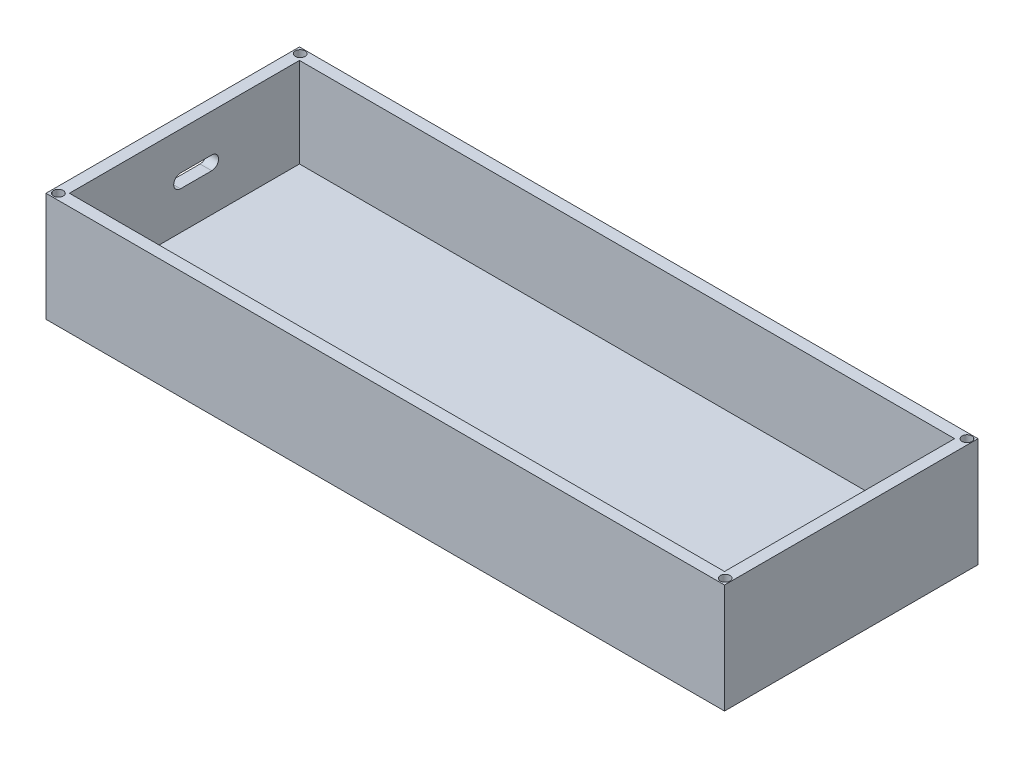
ISO-10303-21;
HEADER;
FILE_DESCRIPTION(('STEP AP214'),'2;1');
FILE_NAME('part.step','',(''),(''),'','','');
FILE_SCHEMA(('AUTOMOTIVE_DESIGN { 1 0 10303 214 1 1 1 1 }'));
ENDSEC;
DATA;
#1=APPLICATION_CONTEXT('core data for automotive mechanical design processes');
#2=APPLICATION_PROTOCOL_DEFINITION('international standard','automotive_design',2000,#1);
#3=PRODUCT_CONTEXT('',#1,'mechanical');
#4=PRODUCT('Part','Part','',(#3));
#5=PRODUCT_RELATED_PRODUCT_CATEGORY('part','',(#4));
#6=PRODUCT_DEFINITION_FORMATION('','',#4);
#7=PRODUCT_DEFINITION_CONTEXT('part definition',#1,'design');
#8=PRODUCT_DEFINITION('design','',#6,#7);
#9=PRODUCT_DEFINITION_SHAPE('','',#8);
#10=(LENGTH_UNIT() NAMED_UNIT(*) SI_UNIT(.MILLI.,.METRE.));
#11=(NAMED_UNIT(*) PLANE_ANGLE_UNIT() SI_UNIT($,.RADIAN.));
#12=(NAMED_UNIT(*) SI_UNIT($,.STERADIAN.) SOLID_ANGLE_UNIT());
#13=UNCERTAINTY_MEASURE_WITH_UNIT(LENGTH_MEASURE(1.E-05),#10,'distance_accuracy_value','');
#14=(GEOMETRIC_REPRESENTATION_CONTEXT(3) GLOBAL_UNCERTAINTY_ASSIGNED_CONTEXT((#13)) GLOBAL_UNIT_ASSIGNED_CONTEXT((#10,
#11,#12)) REPRESENTATION_CONTEXT('',''));
#15=CARTESIAN_POINT('',(0.,0.,0.));
#16=DIRECTION('',(0.,0.,1.));
#17=DIRECTION('',(1.,0.,0.));
#18=AXIS2_PLACEMENT_3D('',#15,#16,#17);
#19=CARTESIAN_POINT('',(129.071142086162,24.,-29.5899705380453));
#20=DIRECTION('',(0.,1.,0.));
#21=DIRECTION('',(0.,0.,1.));
#22=AXIS2_PLACEMENT_3D('',#19,#20,#21);
#23=PLANE('',#22);
#24=CARTESIAN_POINT('',(129.071142086162,24.,-29.5899705380453));
#25=DIRECTION('',(0.,1.,0.));
#26=DIRECTION('',(0.,0.,1.));
#27=AXIS2_PLACEMENT_3D('',#24,#25,#26);
#28=CIRCLE('',#27,1.25);
#29=CARTESIAN_POINT('',(129.071142086162,24.,-28.3399705380453));
#30=VERTEX_POINT('',#29);
#31=EDGE_CURVE('E11',#30,#30,#28,.T.);
#32=ORIENTED_EDGE('',*,*,#31,.T.);
#33=EDGE_LOOP('',(#32));
#34=FACE_BOUND('',#33,.T.);
#35=ADVANCED_FACE('F33',(#34),#23,.T.);
#36=CARTESIAN_POINT('',(129.071142086162,24.,-29.5899705380453));
#37=DIRECTION('',(0.,1.,0.));
#38=DIRECTION('',(0.,0.,1.));
#39=AXIS2_PLACEMENT_3D('',#36,#37,#38);
#40=CYLINDRICAL_SURFACE('',#39,1.25);
#41=ORIENTED_EDGE('',*,*,#31,.F.);
#42=EDGE_LOOP('',(#41));
#43=FACE_BOUND('',#42,.T.);
#44=CARTESIAN_POINT('',(129.071142086162,28.,-29.5899705380453));
#45=DIRECTION('',(0.,1.,0.));
#46=DIRECTION('',(0.,0.,1.));
#47=AXIS2_PLACEMENT_3D('',#44,#45,#46);
#48=CIRCLE('',#47,1.25);
#49=CARTESIAN_POINT('',(129.071142086162,28.,-28.3399705380453));
#50=VERTEX_POINT('',#49);
#51=EDGE_CURVE('E40',#50,#50,#48,.T.);
#52=ORIENTED_EDGE('',*,*,#51,.T.);
#53=EDGE_LOOP('',(#52));
#54=FACE_BOUND('',#53,.T.);
#55=ADVANCED_FACE('F226',(#43,#54),#40,.F.);
#56=CARTESIAN_POINT('',(129.071142086162,24.,32.4100294619547));
#57=DIRECTION('',(0.,1.,0.));
#58=DIRECTION('',(0.,0.,1.));
#59=AXIS2_PLACEMENT_3D('',#56,#57,#58);
#60=PLANE('',#59);
#61=CARTESIAN_POINT('',(129.071142086162,24.,32.4100294619547));
#62=DIRECTION('',(0.,1.,0.));
#63=DIRECTION('',(0.,0.,1.));
#64=AXIS2_PLACEMENT_3D('',#61,#62,#63);
#65=CIRCLE('',#64,1.25);
#66=CARTESIAN_POINT('',(129.071142086162,24.,33.6600294619547));
#67=VERTEX_POINT('',#66);
#68=EDGE_CURVE('E221',#67,#67,#65,.T.);
#69=ORIENTED_EDGE('',*,*,#68,.T.);
#70=EDGE_LOOP('',(#69));
#71=FACE_BOUND('',#70,.T.);
#72=ADVANCED_FACE('F252',(#71),#60,.T.);
#73=CARTESIAN_POINT('',(129.071142086162,24.,32.4100294619547));
#74=DIRECTION('',(0.,1.,0.));
#75=DIRECTION('',(0.,0.,1.));
#76=AXIS2_PLACEMENT_3D('',#73,#74,#75);
#77=CYLINDRICAL_SURFACE('',#76,1.25);
#78=ORIENTED_EDGE('',*,*,#68,.F.);
#79=EDGE_LOOP('',(#78));
#80=FACE_BOUND('',#79,.T.);
#81=CARTESIAN_POINT('',(129.071142086162,28.,32.4100294619547));
#82=DIRECTION('',(0.,1.,0.));
#83=DIRECTION('',(0.,0.,1.));
#84=AXIS2_PLACEMENT_3D('',#81,#82,#83);
#85=CIRCLE('',#84,1.25);
#86=CARTESIAN_POINT('',(129.071142086162,28.,33.6600294619547));
#87=VERTEX_POINT('',#86);
#88=EDGE_CURVE('E218',#87,#87,#85,.T.);
#89=ORIENTED_EDGE('',*,*,#88,.T.);
#90=EDGE_LOOP('',(#89));
#91=FACE_BOUND('',#90,.T.);
#92=ADVANCED_FACE('F258',(#80,#91),#77,.F.);
#93=CARTESIAN_POINT('',(-43.5146443514644,5.,-31.0041841004184));
#94=DIRECTION('',(1.,0.,0.));
#95=DIRECTION('',(0.,0.,-1.));
#96=AXIS2_PLACEMENT_3D('',#93,#94,#95);
#97=PLANE('',#96);
#98=DIRECTION('',(0.,0.,1.));
#99=VECTOR('',#98,1.);
#100=CARTESIAN_POINT('',(-43.5146443514644,14.75,-5.5041841004184));
#101=LINE('',#100,#99);
#102=CARTESIAN_POINT('',(-43.5146443514644,14.75,-5.5041841004184));
#103=VERTEX_POINT('',#102);
#104=CARTESIAN_POINT('',(-43.5146443514644,14.75,2.49581589958159));
#105=VERTEX_POINT('',#104);
#106=EDGE_CURVE('E133',#103,#105,#101,.T.);
#107=ORIENTED_EDGE('',*,*,#106,.F.);
#108=CARTESIAN_POINT('',(-43.5146443514644,16.5,-5.5041841004184));
#109=DIRECTION('',(-1.,0.,0.));
#110=DIRECTION('',(0.,0.,1.));
#111=AXIS2_PLACEMENT_3D('',#108,#109,#110);
#112=CIRCLE('',#111,1.75);
#113=CARTESIAN_POINT('',(-43.5146443514644,18.25,-5.5041841004184));
#114=VERTEX_POINT('',#113);
#115=EDGE_CURVE('E47',#114,#103,#112,.T.);
#116=ORIENTED_EDGE('',*,*,#115,.F.);
#117=DIRECTION('',(0.,0.,-1.));
#118=VECTOR('',#117,1.);
#119=CARTESIAN_POINT('',(-43.5146443514644,18.25,-5.5041841004184));
#120=LINE('',#119,#118);
#121=CARTESIAN_POINT('',(-43.5146443514644,18.25,2.4958158995816));
#122=VERTEX_POINT('',#121);
#123=EDGE_CURVE('E140',#122,#114,#120,.T.);
#124=ORIENTED_EDGE('',*,*,#123,.F.);
#125=CARTESIAN_POINT('',(-43.5146443514644,16.5,2.4958158995816));
#126=DIRECTION('',(-1.,0.,0.));
#127=DIRECTION('',(0.,0.,1.));
#128=AXIS2_PLACEMENT_3D('',#125,#126,#127);
#129=CIRCLE('',#128,1.75);
#130=EDGE_CURVE('E124',#105,#122,#129,.T.);
#131=ORIENTED_EDGE('',*,*,#130,.F.);
#132=EDGE_LOOP('',(#107,#116,#124,#131));
#133=FACE_BOUND('',#132,.T.);
#134=DIRECTION('',(0.,0.,1.));
#135=VECTOR('',#134,1.);
#136=CARTESIAN_POINT('',(-43.5146443514644,0.,-31.0041841004184));
#137=LINE('',#136,#135);
#138=CARTESIAN_POINT('',(-43.5146443514644,0.,-31.0041841004184));
#139=VERTEX_POINT('',#138);
#140=CARTESIAN_POINT('',(-43.5146443514644,0.,33.9958158995816));
#141=VERTEX_POINT('',#140);
#142=EDGE_CURVE('E190',#139,#141,#137,.T.);
#143=ORIENTED_EDGE('',*,*,#142,.T.);
#144=DIRECTION('',(0.,-1.,0.));
#145=VECTOR('',#144,1.);
#146=CARTESIAN_POINT('',(-43.5146443514644,5.,33.9958158995816));
#147=LINE('',#146,#145);
#148=CARTESIAN_POINT('',(-43.5146443514644,28.,33.9958158995816));
#149=VERTEX_POINT('',#148);
#150=EDGE_CURVE('E208',#149,#141,#147,.T.);
#151=ORIENTED_EDGE('',*,*,#150,.F.);
#152=DIRECTION('',(0.,0.,1.));
#153=VECTOR('',#152,1.);
#154=CARTESIAN_POINT('',(-43.5146443514644,28.,33.9958158995816));
#155=LINE('',#154,#153);
#156=CARTESIAN_POINT('',(-43.5146443514644,28.,-31.0041841004184));
#157=VERTEX_POINT('',#156);
#158=EDGE_CURVE('E178',#157,#149,#155,.T.);
#159=ORIENTED_EDGE('',*,*,#158,.F.);
#160=DIRECTION('',(0.,-1.,0.));
#161=VECTOR('',#160,1.);
#162=CARTESIAN_POINT('',(-43.5146443514644,5.,-31.0041841004184));
#163=LINE('',#162,#161);
#164=EDGE_CURVE('E199',#157,#139,#163,.T.);
#165=ORIENTED_EDGE('',*,*,#164,.T.);
#166=EDGE_LOOP('',(#143,#151,#159,#165));
#167=FACE_BOUND('',#166,.T.);
#168=ADVANCED_FACE('F137',(#133,#167),#97,.F.);
#169=CARTESIAN_POINT('',(-43.5146443514644,5.,33.9958158995816));
#170=DIRECTION('',(0.,0.,-1.));
#171=DIRECTION('',(-1.,0.,0.));
#172=AXIS2_PLACEMENT_3D('',#169,#170,#171);
#173=PLANE('',#172);
#174=DIRECTION('',(1.,0.,0.));
#175=VECTOR('',#174,1.);
#176=CARTESIAN_POINT('',(-43.5146443514644,0.,33.9958158995816));
#177=LINE('',#176,#175);
#178=CARTESIAN_POINT('',(130.485355648536,0.,33.9958158995816));
#179=VERTEX_POINT('',#178);
#180=EDGE_CURVE('E193',#141,#179,#177,.T.);
#181=ORIENTED_EDGE('',*,*,#180,.T.);
#182=DIRECTION('',(0.,-1.,0.));
#183=VECTOR('',#182,1.);
#184=CARTESIAN_POINT('',(130.485355648536,5.,33.9958158995816));
#185=LINE('',#184,#183);
#186=CARTESIAN_POINT('',(130.485355648536,28.,33.9958158995816));
#187=VERTEX_POINT('',#186);
#188=EDGE_CURVE('E205',#187,#179,#185,.T.);
#189=ORIENTED_EDGE('',*,*,#188,.F.);
#190=DIRECTION('',(1.,0.,0.));
#191=VECTOR('',#190,1.);
#192=CARTESIAN_POINT('',(-43.5146443514644,28.,33.9958158995816));
#193=LINE('',#192,#191);
#194=EDGE_CURVE('E181',#149,#187,#193,.T.);
#195=ORIENTED_EDGE('',*,*,#194,.F.);
#196=ORIENTED_EDGE('',*,*,#150,.T.);
#197=EDGE_LOOP('',(#181,#189,#195,#196));
#198=FACE_BOUND('',#197,.T.);
#199=ADVANCED_FACE('F267',(#198),#173,.F.);
#200=CARTESIAN_POINT('',(130.485355648536,5.,-31.0041841004184));
#201=DIRECTION('',(-1.,0.,0.));
#202=DIRECTION('',(0.,0.,1.));
#203=AXIS2_PLACEMENT_3D('',#200,#201,#202);
#204=PLANE('',#203);
#205=DIRECTION('',(0.,0.,-1.));
#206=VECTOR('',#205,1.);
#207=CARTESIAN_POINT('',(130.485355648536,0.,-31.0041841004184));
#208=LINE('',#207,#206);
#209=CARTESIAN_POINT('',(130.485355648536,0.,-31.0041841004184));
#210=VERTEX_POINT('',#209);
#211=EDGE_CURVE('E195',#179,#210,#208,.T.);
#212=ORIENTED_EDGE('',*,*,#211,.T.);
#213=DIRECTION('',(0.,-1.,0.));
#214=VECTOR('',#213,1.);
#215=CARTESIAN_POINT('',(130.485355648536,5.,-31.0041841004184));
#216=LINE('',#215,#214);
#217=CARTESIAN_POINT('',(130.485355648536,28.,-31.0041841004184));
#218=VERTEX_POINT('',#217);
#219=EDGE_CURVE('E202',#218,#210,#216,.T.);
#220=ORIENTED_EDGE('',*,*,#219,.F.);
#221=DIRECTION('',(0.,0.,-1.));
#222=VECTOR('',#221,1.);
#223=CARTESIAN_POINT('',(130.485355648536,28.,33.9958158995816));
#224=LINE('',#223,#222);
#225=EDGE_CURVE('E184',#187,#218,#224,.T.);
#226=ORIENTED_EDGE('',*,*,#225,.F.);
#227=ORIENTED_EDGE('',*,*,#188,.T.);
#228=EDGE_LOOP('',(#212,#220,#226,#227));
#229=FACE_BOUND('',#228,.T.);
#230=ADVANCED_FACE('F270',(#229),#204,.F.);
#231=CARTESIAN_POINT('',(-43.5146443514644,5.,-31.0041841004184));
#232=DIRECTION('',(0.,0.,1.));
#233=DIRECTION('',(1.,0.,0.));
#234=AXIS2_PLACEMENT_3D('',#231,#232,#233);
#235=PLANE('',#234);
#236=DIRECTION('',(-1.,0.,0.));
#237=VECTOR('',#236,1.);
#238=CARTESIAN_POINT('',(-43.5146443514644,0.,-31.0041841004184));
#239=LINE('',#238,#237);
#240=EDGE_CURVE('E197',#210,#139,#239,.T.);
#241=ORIENTED_EDGE('',*,*,#240,.T.);
#242=ORIENTED_EDGE('',*,*,#164,.F.);
#243=DIRECTION('',(-1.,0.,0.));
#244=VECTOR('',#243,1.);
#245=CARTESIAN_POINT('',(-43.5146443514644,28.,-31.0041841004184));
#246=LINE('',#245,#244);
#247=EDGE_CURVE('E187',#218,#157,#246,.T.);
#248=ORIENTED_EDGE('',*,*,#247,.F.);
#249=ORIENTED_EDGE('',*,*,#219,.T.);
#250=EDGE_LOOP('',(#241,#242,#248,#249));
#251=FACE_BOUND('',#250,.T.);
#252=ADVANCED_FACE('F241',(#251),#235,.F.);
#253=CARTESIAN_POINT('',(0.,0.,0.));
#254=DIRECTION('',(0.,1.,0.));
#255=DIRECTION('',(0.,0.,1.));
#256=AXIS2_PLACEMENT_3D('',#253,#254,#255);
#257=PLANE('',#256);
#258=ORIENTED_EDGE('',*,*,#142,.F.);
#259=ORIENTED_EDGE('',*,*,#240,.F.);
#260=ORIENTED_EDGE('',*,*,#211,.F.);
#261=ORIENTED_EDGE('',*,*,#180,.F.);
#262=EDGE_LOOP('',(#258,#259,#260,#261));
#263=FACE_BOUND('',#262,.T.);
#264=ADVANCED_FACE('F231',(#263),#257,.F.);
#265=CARTESIAN_POINT('',(0.,28.,0.));
#266=DIRECTION('',(0.,-1.,0.));
#267=DIRECTION('',(0.,0.,-1.));
#268=AXIS2_PLACEMENT_3D('',#265,#266,#267);
#269=PLANE('',#268);
#270=CARTESIAN_POINT('',(-41.9288579138375,28.,-29.5899705380453));
#271=DIRECTION('',(0.,1.,0.));
#272=DIRECTION('',(0.,0.,1.));
#273=AXIS2_PLACEMENT_3D('',#270,#271,#272);
#274=CIRCLE('',#273,1.25);
#275=CARTESIAN_POINT('',(-41.9288579138375,28.,-28.3399705380453));
#276=VERTEX_POINT('',#275);
#277=EDGE_CURVE('E342',#276,#276,#274,.T.);
#278=ORIENTED_EDGE('',*,*,#277,.F.);
#279=EDGE_LOOP('',(#278));
#280=FACE_BOUND('',#279,.T.);
#281=CARTESIAN_POINT('',(-41.9288579138375,28.,32.4100294619547));
#282=DIRECTION('',(0.,1.,0.));
#283=DIRECTION('',(0.,0.,1.));
#284=AXIS2_PLACEMENT_3D('',#281,#282,#283);
#285=CIRCLE('',#284,1.25);
#286=CARTESIAN_POINT('',(-41.9288579138375,28.,33.6600294619547));
#287=VERTEX_POINT('',#286);
#288=EDGE_CURVE('E341',#287,#287,#285,.T.);
#289=ORIENTED_EDGE('',*,*,#288,.F.);
#290=EDGE_LOOP('',(#289));
#291=FACE_BOUND('',#290,.T.);
#292=ORIENTED_EDGE('',*,*,#158,.T.);
#293=ORIENTED_EDGE('',*,*,#194,.T.);
#294=ORIENTED_EDGE('',*,*,#225,.T.);
#295=ORIENTED_EDGE('',*,*,#247,.T.);
#296=EDGE_LOOP('',(#292,#293,#294,#295));
#297=FACE_BOUND('',#296,.T.);
#298=DIRECTION('',(1.,0.,0.));
#299=VECTOR('',#298,1.);
#300=CARTESIAN_POINT('',(-40.5146443514644,28.,30.9958158995816));
#301=LINE('',#300,#299);
#302=CARTESIAN_POINT('',(-40.5146443514644,28.,30.9958158995816));
#303=VERTEX_POINT('',#302);
#304=CARTESIAN_POINT('',(127.485355648536,28.,30.9958158995816));
#305=VERTEX_POINT('',#304);
#306=EDGE_CURVE('E150',#303,#305,#301,.T.);
#307=ORIENTED_EDGE('',*,*,#306,.F.);
#308=DIRECTION('',(0.,0.,1.));
#309=VECTOR('',#308,1.);
#310=CARTESIAN_POINT('',(-40.5146443514644,28.,30.9958158995816));
#311=LINE('',#310,#309);
#312=CARTESIAN_POINT('',(-40.5146443514644,28.,-28.0041841004184));
#313=VERTEX_POINT('',#312);
#314=EDGE_CURVE('E158',#313,#303,#311,.T.);
#315=ORIENTED_EDGE('',*,*,#314,.F.);
#316=DIRECTION('',(-1.,0.,0.));
#317=VECTOR('',#316,1.);
#318=CARTESIAN_POINT('',(-40.5146443514644,28.,-28.0041841004184));
#319=LINE('',#318,#317);
#320=CARTESIAN_POINT('',(127.485355648536,28.,-28.0041841004184));
#321=VERTEX_POINT('',#320);
#322=EDGE_CURVE('E155',#321,#313,#319,.T.);
#323=ORIENTED_EDGE('',*,*,#322,.F.);
#324=DIRECTION('',(0.,0.,-1.));
#325=VECTOR('',#324,1.);
#326=CARTESIAN_POINT('',(127.485355648536,28.,30.9958158995816));
#327=LINE('',#326,#325);
#328=EDGE_CURVE('E152',#305,#321,#327,.T.);
#329=ORIENTED_EDGE('',*,*,#328,.F.);
#330=EDGE_LOOP('',(#307,#315,#323,#329));
#331=FACE_BOUND('',#330,.T.);
#332=ORIENTED_EDGE('',*,*,#88,.F.);
#333=EDGE_LOOP('',(#332));
#334=FACE_BOUND('',#333,.T.);
#335=ORIENTED_EDGE('',*,*,#51,.F.);
#336=EDGE_LOOP('',(#335));
#337=FACE_BOUND('',#336,.T.);
#338=ADVANCED_FACE('F228',(#280,#291,#297,#331,#334,#337),#269,.F.);
#339=CARTESIAN_POINT('',(-40.5146443514644,28.,30.9958158995816));
#340=DIRECTION('',(0.,0.,-1.));
#341=DIRECTION('',(-1.,0.,0.));
#342=AXIS2_PLACEMENT_3D('',#339,#340,#341);
#343=PLANE('',#342);
#344=DIRECTION('',(1.,0.,0.));
#345=VECTOR('',#344,1.);
#346=CARTESIAN_POINT('',(-40.5146443514644,5.,30.9958158995816));
#347=LINE('',#346,#345);
#348=CARTESIAN_POINT('',(-40.5146443514644,5.,30.9958158995816));
#349=VERTEX_POINT('',#348);
#350=CARTESIAN_POINT('',(127.485355648536,5.,30.9958158995816));
#351=VERTEX_POINT('',#350);
#352=EDGE_CURVE('E147',#349,#351,#347,.T.);
#353=ORIENTED_EDGE('',*,*,#352,.F.);
#354=DIRECTION('',(0.,-1.,0.));
#355=VECTOR('',#354,1.);
#356=CARTESIAN_POINT('',(-40.5146443514644,28.,30.9958158995816));
#357=LINE('',#356,#355);
#358=EDGE_CURVE('E160',#303,#349,#357,.T.);
#359=ORIENTED_EDGE('',*,*,#358,.F.);
#360=ORIENTED_EDGE('',*,*,#306,.T.);
#361=DIRECTION('',(0.,-1.,0.));
#362=VECTOR('',#361,1.);
#363=CARTESIAN_POINT('',(127.485355648536,28.,30.9958158995816));
#364=LINE('',#363,#362);
#365=EDGE_CURVE('E175',#305,#351,#364,.T.);
#366=ORIENTED_EDGE('',*,*,#365,.T.);
#367=EDGE_LOOP('',(#353,#359,#360,#366));
#368=FACE_BOUND('',#367,.T.);
#369=ADVANCED_FACE('F230',(#368),#343,.T.);
#370=CARTESIAN_POINT('',(127.485355648536,28.,30.9958158995816));
#371=DIRECTION('',(-1.,0.,0.));
#372=DIRECTION('',(0.,0.,1.));
#373=AXIS2_PLACEMENT_3D('',#370,#371,#372);
#374=PLANE('',#373);
#375=DIRECTION('',(0.,0.,-1.));
#376=VECTOR('',#375,1.);
#377=CARTESIAN_POINT('',(127.485355648536,5.,30.9958158995816));
#378=LINE('',#377,#376);
#379=CARTESIAN_POINT('',(127.485355648536,5.,-28.0041841004184));
#380=VERTEX_POINT('',#379);
#381=EDGE_CURVE('E162',#351,#380,#378,.T.);
#382=ORIENTED_EDGE('',*,*,#381,.F.);
#383=ORIENTED_EDGE('',*,*,#365,.F.);
#384=ORIENTED_EDGE('',*,*,#328,.T.);
#385=DIRECTION('',(0.,-1.,0.));
#386=VECTOR('',#385,1.);
#387=CARTESIAN_POINT('',(127.485355648536,28.,-28.0041841004184));
#388=LINE('',#387,#386);
#389=EDGE_CURVE('E172',#321,#380,#388,.T.);
#390=ORIENTED_EDGE('',*,*,#389,.T.);
#391=EDGE_LOOP('',(#382,#383,#384,#390));
#392=FACE_BOUND('',#391,.T.);
#393=ADVANCED_FACE('F238',(#392),#374,.T.);
#394=CARTESIAN_POINT('',(-40.5146443514644,28.,-28.0041841004184));
#395=DIRECTION('',(0.,0.,1.));
#396=DIRECTION('',(1.,0.,0.));
#397=AXIS2_PLACEMENT_3D('',#394,#395,#396);
#398=PLANE('',#397);
#399=DIRECTION('',(-1.,0.,0.));
#400=VECTOR('',#399,1.);
#401=CARTESIAN_POINT('',(-40.5146443514644,5.,-28.0041841004184));
#402=LINE('',#401,#400);
#403=CARTESIAN_POINT('',(-40.5146443514644,5.,-28.0041841004184));
#404=VERTEX_POINT('',#403);
#405=EDGE_CURVE('E164',#380,#404,#402,.T.);
#406=ORIENTED_EDGE('',*,*,#405,.F.);
#407=ORIENTED_EDGE('',*,*,#389,.F.);
#408=ORIENTED_EDGE('',*,*,#322,.T.);
#409=DIRECTION('',(0.,-1.,0.));
#410=VECTOR('',#409,1.);
#411=CARTESIAN_POINT('',(-40.5146443514644,28.,-28.0041841004184));
#412=LINE('',#411,#410);
#413=EDGE_CURVE('E169',#313,#404,#412,.T.);
#414=ORIENTED_EDGE('',*,*,#413,.T.);
#415=EDGE_LOOP('',(#406,#407,#408,#414));
#416=FACE_BOUND('',#415,.T.);
#417=ADVANCED_FACE('F288',(#416),#398,.T.);
#418=CARTESIAN_POINT('',(-40.5146443514644,28.,30.9958158995816));
#419=DIRECTION('',(1.,0.,0.));
#420=DIRECTION('',(0.,0.,-1.));
#421=AXIS2_PLACEMENT_3D('',#418,#419,#420);
#422=PLANE('',#421);
#423=CARTESIAN_POINT('',(-40.5146443514644,16.5,-5.5041841004184));
#424=DIRECTION('',(1.,0.,0.));
#425=DIRECTION('',(0.,0.,-1.));
#426=AXIS2_PLACEMENT_3D('',#423,#424,#425);
#427=CIRCLE('',#426,1.75);
#428=CARTESIAN_POINT('',(-40.5146443514644,14.75,-5.5041841004184));
#429=VERTEX_POINT('',#428);
#430=CARTESIAN_POINT('',(-40.5146443514644,18.25,-5.5041841004184));
#431=VERTEX_POINT('',#430);
#432=EDGE_CURVE('E216',#429,#431,#427,.T.);
#433=ORIENTED_EDGE('',*,*,#432,.F.);
#434=DIRECTION('',(0.,0.,-1.));
#435=VECTOR('',#434,1.);
#436=CARTESIAN_POINT('',(-40.5146443514644,14.75,30.9958158995816));
#437=LINE('',#436,#435);
#438=CARTESIAN_POINT('',(-40.5146443514644,14.75,2.4958158995816));
#439=VERTEX_POINT('',#438);
#440=EDGE_CURVE('E211',#439,#429,#437,.T.);
#441=ORIENTED_EDGE('',*,*,#440,.F.);
#442=CARTESIAN_POINT('',(-40.5146443514644,16.5,2.4958158995816));
#443=DIRECTION('',(1.,0.,0.));
#444=DIRECTION('',(0.,0.,-1.));
#445=AXIS2_PLACEMENT_3D('',#442,#443,#444);
#446=CIRCLE('',#445,1.75);
#447=CARTESIAN_POINT('',(-40.5146443514644,18.25,2.4958158995816));
#448=VERTEX_POINT('',#447);
#449=EDGE_CURVE('E127',#448,#439,#446,.T.);
#450=ORIENTED_EDGE('',*,*,#449,.F.);
#451=DIRECTION('',(0.,0.,1.));
#452=VECTOR('',#451,1.);
#453=CARTESIAN_POINT('',(-40.5146443514644,18.25,30.9958158995816));
#454=LINE('',#453,#452);
#455=EDGE_CURVE('E214',#431,#448,#454,.T.);
#456=ORIENTED_EDGE('',*,*,#455,.F.);
#457=EDGE_LOOP('',(#433,#441,#450,#456));
#458=FACE_BOUND('',#457,.T.);
#459=DIRECTION('',(0.,0.,1.));
#460=VECTOR('',#459,1.);
#461=CARTESIAN_POINT('',(-40.5146443514644,5.,30.9958158995816));
#462=LINE('',#461,#460);
#463=EDGE_CURVE('E153',#404,#349,#462,.T.);
#464=ORIENTED_EDGE('',*,*,#463,.F.);
#465=ORIENTED_EDGE('',*,*,#413,.F.);
#466=ORIENTED_EDGE('',*,*,#314,.T.);
#467=ORIENTED_EDGE('',*,*,#358,.T.);
#468=EDGE_LOOP('',(#464,#465,#466,#467));
#469=FACE_BOUND('',#468,.T.);
#470=ADVANCED_FACE('F280',(#458,#469),#422,.T.);
#471=CARTESIAN_POINT('',(0.,5.,0.));
#472=DIRECTION('',(0.,1.,0.));
#473=DIRECTION('',(0.,0.,1.));
#474=AXIS2_PLACEMENT_3D('',#471,#472,#473);
#475=PLANE('',#474);
#476=ORIENTED_EDGE('',*,*,#352,.T.);
#477=ORIENTED_EDGE('',*,*,#381,.T.);
#478=ORIENTED_EDGE('',*,*,#405,.T.);
#479=ORIENTED_EDGE('',*,*,#463,.T.);
#480=EDGE_LOOP('',(#476,#477,#478,#479));
#481=FACE_BOUND('',#480,.T.);
#482=ADVANCED_FACE('F277',(#481),#475,.T.);
#483=CARTESIAN_POINT('',(-20.5146443514644,16.5,-5.5041841004184));
#484=DIRECTION('',(-1.,0.,0.));
#485=DIRECTION('',(0.,0.,1.));
#486=AXIS2_PLACEMENT_3D('',#483,#484,#485);
#487=CYLINDRICAL_SURFACE('',#486,1.75);
#488=ORIENTED_EDGE('',*,*,#432,.T.);
#489=DIRECTION('',(-1.,0.,0.));
#490=VECTOR('',#489,1.);
#491=CARTESIAN_POINT('',(-20.5146443514644,18.25,-5.5041841004184));
#492=LINE('',#491,#490);
#493=EDGE_CURVE('E145',#431,#114,#492,.T.);
#494=ORIENTED_EDGE('',*,*,#493,.T.);
#495=ORIENTED_EDGE('',*,*,#115,.T.);
#496=DIRECTION('',(-1.,0.,0.));
#497=VECTOR('',#496,1.);
#498=CARTESIAN_POINT('',(-20.5146443514644,14.75,-5.5041841004184));
#499=LINE('',#498,#497);
#500=EDGE_CURVE('E130',#429,#103,#499,.T.);
#501=ORIENTED_EDGE('',*,*,#500,.F.);
#502=EDGE_LOOP('',(#488,#494,#495,#501));
#503=FACE_BOUND('',#502,.T.);
#504=ADVANCED_FACE('F279',(#503),#487,.F.);
#505=CARTESIAN_POINT('',(-20.5146443514644,18.25,-5.5041841004184));
#506=DIRECTION('',(0.,1.,0.));
#507=DIRECTION('',(0.,0.,1.));
#508=AXIS2_PLACEMENT_3D('',#505,#506,#507);
#509=PLANE('',#508);
#510=ORIENTED_EDGE('',*,*,#455,.T.);
#511=DIRECTION('',(-1.,0.,0.));
#512=VECTOR('',#511,1.);
#513=CARTESIAN_POINT('',(-20.5146443514644,18.25,2.4958158995816));
#514=LINE('',#513,#512);
#515=EDGE_CURVE('E129',#448,#122,#514,.T.);
#516=ORIENTED_EDGE('',*,*,#515,.T.);
#517=ORIENTED_EDGE('',*,*,#123,.T.);
#518=ORIENTED_EDGE('',*,*,#493,.F.);
#519=EDGE_LOOP('',(#510,#516,#517,#518));
#520=FACE_BOUND('',#519,.T.);
#521=ADVANCED_FACE('F286',(#520),#509,.F.);
#522=CARTESIAN_POINT('',(-20.5146443514644,16.5,2.4958158995816));
#523=DIRECTION('',(-1.,0.,0.));
#524=DIRECTION('',(0.,0.,1.));
#525=AXIS2_PLACEMENT_3D('',#522,#523,#524);
#526=CYLINDRICAL_SURFACE('',#525,1.75);
#527=ORIENTED_EDGE('',*,*,#449,.T.);
#528=DIRECTION('',(-1.,0.,0.));
#529=VECTOR('',#528,1.);
#530=CARTESIAN_POINT('',(-20.5146443514644,14.75,2.49581589958159));
#531=LINE('',#530,#529);
#532=EDGE_CURVE('E55',#439,#105,#531,.T.);
#533=ORIENTED_EDGE('',*,*,#532,.T.);
#534=ORIENTED_EDGE('',*,*,#130,.T.);
#535=ORIENTED_EDGE('',*,*,#515,.F.);
#536=EDGE_LOOP('',(#527,#533,#534,#535));
#537=FACE_BOUND('',#536,.T.);
#538=ADVANCED_FACE('F121',(#537),#526,.F.);
#539=CARTESIAN_POINT('',(-20.5146443514644,14.75,-5.5041841004184));
#540=DIRECTION('',(0.,-1.,0.));
#541=DIRECTION('',(0.,0.,-1.));
#542=AXIS2_PLACEMENT_3D('',#539,#540,#541);
#543=PLANE('',#542);
#544=ORIENTED_EDGE('',*,*,#440,.T.);
#545=ORIENTED_EDGE('',*,*,#500,.T.);
#546=ORIENTED_EDGE('',*,*,#106,.T.);
#547=ORIENTED_EDGE('',*,*,#532,.F.);
#548=EDGE_LOOP('',(#544,#545,#546,#547));
#549=FACE_BOUND('',#548,.T.);
#550=ADVANCED_FACE('F134',(#549),#543,.F.);
#551=CARTESIAN_POINT('',(-41.9288579138375,24.,32.4100294619547));
#552=DIRECTION('',(0.,1.,0.));
#553=DIRECTION('',(0.,0.,1.));
#554=AXIS2_PLACEMENT_3D('',#551,#552,#553);
#555=CYLINDRICAL_SURFACE('',#554,1.25);
#556=CARTESIAN_POINT('',(-41.9288579138375,24.,32.4100294619547));
#557=DIRECTION('',(0.,1.,0.));
#558=DIRECTION('',(0.,0.,1.));
#559=AXIS2_PLACEMENT_3D('',#556,#557,#558);
#560=CIRCLE('',#559,1.25);
#561=CARTESIAN_POINT('',(-41.9288579138375,24.,33.6600294619547));
#562=VERTEX_POINT('',#561);
#563=EDGE_CURVE('E345',#562,#562,#560,.T.);
#564=ORIENTED_EDGE('',*,*,#563,.F.);
#565=EDGE_LOOP('',(#564));
#566=FACE_BOUND('',#565,.T.);
#567=ORIENTED_EDGE('',*,*,#288,.T.);
#568=EDGE_LOOP('',(#567));
#569=FACE_BOUND('',#568,.T.);
#570=ADVANCED_FACE('F316',(#566,#569),#555,.F.);
#571=CARTESIAN_POINT('',(-41.9288579138375,24.,32.4100294619547));
#572=DIRECTION('',(0.,1.,0.));
#573=DIRECTION('',(0.,0.,1.));
#574=AXIS2_PLACEMENT_3D('',#571,#572,#573);
#575=PLANE('',#574);
#576=ORIENTED_EDGE('',*,*,#563,.T.);
#577=EDGE_LOOP('',(#576));
#578=FACE_BOUND('',#577,.T.);
#579=ADVANCED_FACE('F324',(#578),#575,.T.);
#580=CARTESIAN_POINT('',(-41.9288579138375,24.,-29.5899705380453));
#581=DIRECTION('',(0.,1.,0.));
#582=DIRECTION('',(0.,0.,1.));
#583=AXIS2_PLACEMENT_3D('',#580,#581,#582);
#584=CYLINDRICAL_SURFACE('',#583,1.25);
#585=CARTESIAN_POINT('',(-41.9288579138375,24.,-29.5899705380453));
#586=DIRECTION('',(0.,1.,0.));
#587=DIRECTION('',(0.,0.,1.));
#588=AXIS2_PLACEMENT_3D('',#585,#586,#587);
#589=CIRCLE('',#588,1.25);
#590=CARTESIAN_POINT('',(-41.9288579138375,24.,-28.3399705380453));
#591=VERTEX_POINT('',#590);
#592=EDGE_CURVE('E340',#591,#591,#589,.T.);
#593=ORIENTED_EDGE('',*,*,#592,.F.);
#594=EDGE_LOOP('',(#593));
#595=FACE_BOUND('',#594,.T.);
#596=ORIENTED_EDGE('',*,*,#277,.T.);
#597=EDGE_LOOP('',(#596));
#598=FACE_BOUND('',#597,.T.);
#599=ADVANCED_FACE('F328',(#595,#598),#584,.F.);
#600=CARTESIAN_POINT('',(-41.9288579138375,24.,-29.5899705380453));
#601=DIRECTION('',(0.,1.,0.));
#602=DIRECTION('',(0.,0.,1.));
#603=AXIS2_PLACEMENT_3D('',#600,#601,#602);
#604=PLANE('',#603);
#605=ORIENTED_EDGE('',*,*,#592,.T.);
#606=EDGE_LOOP('',(#605));
#607=FACE_BOUND('',#606,.T.);
#608=ADVANCED_FACE('F332',(#607),#604,.T.);
#609=CLOSED_SHELL('',(#35,#55,#72,#92,#168,#199,#230,#252,#264,#338,#369,#393,#417,#470,#482,
#504,#521,#538,#550,#570,#579,#599,#608));
#610=MANIFOLD_SOLID_BREP('B2',#609);
#611=ADVANCED_BREP_SHAPE_REPRESENTATION('',(#18,#610),#14);
#612=SHAPE_DEFINITION_REPRESENTATION(#9,#611);
ENDSEC;
END-ISO-10303-21;
